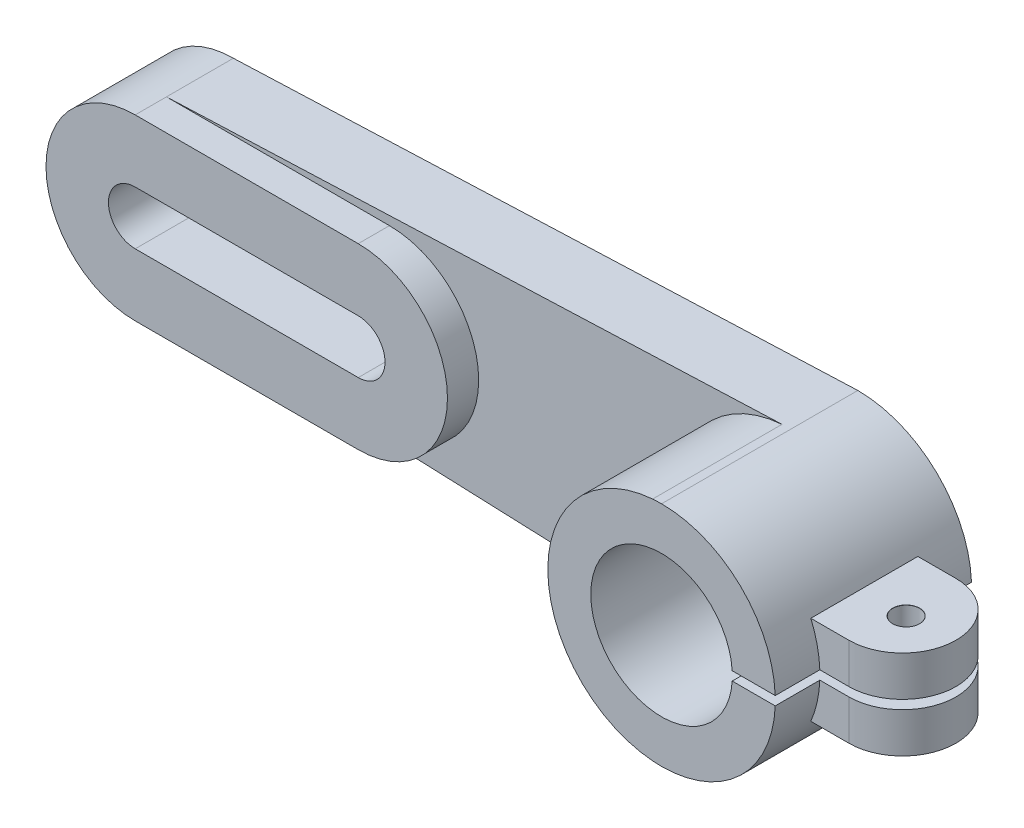
ISO-10303-21;
HEADER;
FILE_DESCRIPTION(('STEP AP214'),'2;1');
FILE_NAME('part.step','',(''),(''),'','','');
FILE_SCHEMA(('AUTOMOTIVE_DESIGN { 1 0 10303 214 1 1 1 1 }'));
ENDSEC;
DATA;
#1=APPLICATION_CONTEXT('core data for automotive mechanical design processes');
#2=APPLICATION_PROTOCOL_DEFINITION('international standard','automotive_design',2000,#1);
#3=PRODUCT_CONTEXT('',#1,'mechanical');
#4=PRODUCT('Part','Part','',(#3));
#5=PRODUCT_RELATED_PRODUCT_CATEGORY('part','',(#4));
#6=PRODUCT_DEFINITION_FORMATION('','',#4);
#7=PRODUCT_DEFINITION_CONTEXT('part definition',#1,'design');
#8=PRODUCT_DEFINITION('design','',#6,#7);
#9=PRODUCT_DEFINITION_SHAPE('','',#8);
#10=(LENGTH_UNIT() NAMED_UNIT(*) SI_UNIT(.MILLI.,.METRE.));
#11=(NAMED_UNIT(*) PLANE_ANGLE_UNIT() SI_UNIT($,.RADIAN.));
#12=(NAMED_UNIT(*) SI_UNIT($,.STERADIAN.) SOLID_ANGLE_UNIT());
#13=UNCERTAINTY_MEASURE_WITH_UNIT(LENGTH_MEASURE(1.E-05),#10,'distance_accuracy_value','');
#14=(GEOMETRIC_REPRESENTATION_CONTEXT(3) GLOBAL_UNCERTAINTY_ASSIGNED_CONTEXT((#13)) GLOBAL_UNIT_ASSIGNED_CONTEXT((#10,
#11,#12)) REPRESENTATION_CONTEXT('',''));
#15=CARTESIAN_POINT('',(0.,0.,0.));
#16=DIRECTION('',(0.,0.,1.));
#17=DIRECTION('',(1.,0.,0.));
#18=AXIS2_PLACEMENT_3D('',#15,#16,#17);
#19=CARTESIAN_POINT('',(32.,-9.99999999999999,22.));
#20=DIRECTION('',(0.,-1.,0.));
#21=DIRECTION('',(0.,0.,-1.));
#22=AXIS2_PLACEMENT_3D('',#19,#20,#21);
#23=CYLINDRICAL_SURFACE('',#22,12.);
#24=DIRECTION('',(0.,-1.,0.));
#25=VECTOR('',#24,1.);
#26=CARTESIAN_POINT('',(32.,0.,34.));
#27=LINE('',#26,#25);
#28=CARTESIAN_POINT('',(32.,-9.99999999999999,34.));
#29=VERTEX_POINT('',#28);
#30=CARTESIAN_POINT('',(32.,-0.999999999999999,34.));
#31=VERTEX_POINT('',#30);
#32=EDGE_CURVE('E389',#29,#31,#27,.F.);
#33=ORIENTED_EDGE('',*,*,#32,.F.);
#34=CARTESIAN_POINT('',(32.,-9.99999999999999,22.));
#35=DIRECTION('',(0.,-1.,0.));
#36=DIRECTION('',(1.,0.,0.));
#37=AXIS2_PLACEMENT_3D('',#34,#35,#36);
#38=CIRCLE('',#37,12.);
#39=CARTESIAN_POINT('',(32.,-9.99999999999999,10.));
#40=VERTEX_POINT('',#39);
#41=EDGE_CURVE('E46',#40,#29,#38,.T.);
#42=ORIENTED_EDGE('',*,*,#41,.F.);
#43=DIRECTION('',(0.,1.,0.));
#44=VECTOR('',#43,1.);
#45=CARTESIAN_POINT('',(32.,-9.99999999999999,10.));
#46=LINE('',#45,#44);
#47=CARTESIAN_POINT('',(32.,-0.999999999999999,10.));
#48=VERTEX_POINT('',#47);
#49=EDGE_CURVE('E391',#48,#40,#46,.F.);
#50=ORIENTED_EDGE('',*,*,#49,.F.);
#51=CARTESIAN_POINT('',(32.,-0.999999999999997,22.));
#52=DIRECTION('',(0.,1.,0.));
#53=DIRECTION('',(-1.,0.,0.));
#54=AXIS2_PLACEMENT_3D('',#51,#52,#53);
#55=CIRCLE('',#54,12.);
#56=EDGE_CURVE('E11',#31,#48,#55,.T.);
#57=ORIENTED_EDGE('',*,*,#56,.F.);
#58=EDGE_LOOP('',(#33,#42,#50,#57));
#59=FACE_BOUND('',#58,.T.);
#60=ADVANCED_FACE('F37',(#59),#23,.T.);
#61=CARTESIAN_POINT('',(32.,1.00000000000001,22.));
#62=DIRECTION('',(0.,1.,0.));
#63=DIRECTION('',(0.,0.,1.));
#64=AXIS2_PLACEMENT_3D('',#61,#62,#63);
#65=CYLINDRICAL_SURFACE('',#64,12.);
#66=DIRECTION('',(0.,-1.,0.));
#67=VECTOR('',#66,1.);
#68=CARTESIAN_POINT('',(32.,1.00000000000001,34.));
#69=LINE('',#68,#67);
#70=CARTESIAN_POINT('',(32.,1.00000000000001,34.));
#71=VERTEX_POINT('',#70);
#72=CARTESIAN_POINT('',(32.,10.,34.));
#73=VERTEX_POINT('',#72);
#74=EDGE_CURVE('E379',#71,#73,#69,.F.);
#75=ORIENTED_EDGE('',*,*,#74,.F.);
#76=CARTESIAN_POINT('',(32.,1.00000000000001,22.));
#77=DIRECTION('',(0.,1.,0.));
#78=DIRECTION('',(0.,0.,1.));
#79=AXIS2_PLACEMENT_3D('',#76,#77,#78);
#80=CIRCLE('',#79,12.);
#81=CARTESIAN_POINT('',(32.,1.00000000000001,10.));
#82=VERTEX_POINT('',#81);
#83=EDGE_CURVE('E385',#82,#71,#80,.F.);
#84=ORIENTED_EDGE('',*,*,#83,.F.);
#85=DIRECTION('',(0.,1.,0.));
#86=VECTOR('',#85,1.);
#87=CARTESIAN_POINT('',(32.,0.,10.));
#88=LINE('',#87,#86);
#89=CARTESIAN_POINT('',(32.,10.,10.));
#90=VERTEX_POINT('',#89);
#91=EDGE_CURVE('E382',#90,#82,#88,.F.);
#92=ORIENTED_EDGE('',*,*,#91,.F.);
#93=CARTESIAN_POINT('',(32.,10.,22.));
#94=DIRECTION('',(0.,-1.,0.));
#95=DIRECTION('',(1.,0.,0.));
#96=AXIS2_PLACEMENT_3D('',#93,#94,#95);
#97=CIRCLE('',#96,12.);
#98=EDGE_CURVE('E387',#73,#90,#97,.F.);
#99=ORIENTED_EDGE('',*,*,#98,.F.);
#100=EDGE_LOOP('',(#75,#84,#92,#99));
#101=FACE_BOUND('',#100,.T.);
#102=ADVANCED_FACE('F438',(#101),#65,.T.);
#103=CARTESIAN_POINT('',(0.,0.,44.));
#104=DIRECTION('',(0.,0.,-1.));
#105=DIRECTION('',(-1.,0.,0.));
#106=AXIS2_PLACEMENT_3D('',#103,#104,#105);
#107=CYLINDRICAL_SURFACE('',#106,15.8675);
#108=CARTESIAN_POINT('',(0.,0.,0.));
#109=DIRECTION('',(0.,0.,1.));
#110=DIRECTION('',(1.,0.,0.));
#111=AXIS2_PLACEMENT_3D('',#108,#109,#110);
#112=CIRCLE('',#111,15.8675);
#113=CARTESIAN_POINT('',(15.8359576991731,1.00000000000001,0.));
#114=VERTEX_POINT('',#113);
#115=CARTESIAN_POINT('',(15.8359576991731,-1.,0.));
#116=VERTEX_POINT('',#115);
#117=EDGE_CURVE('E324',#114,#116,#112,.T.);
#118=ORIENTED_EDGE('',*,*,#117,.F.);
#119=DIRECTION('',(0.,0.,-1.));
#120=VECTOR('',#119,1.);
#121=CARTESIAN_POINT('',(15.8359576991731,1.00000000000001,44.));
#122=LINE('',#121,#120);
#123=CARTESIAN_POINT('',(15.8359576991731,1.00000000000001,44.));
#124=VERTEX_POINT('',#123);
#125=EDGE_CURVE('E377',#124,#114,#122,.T.);
#126=ORIENTED_EDGE('',*,*,#125,.F.);
#127=CARTESIAN_POINT('',(0.,0.,44.));
#128=DIRECTION('',(0.,0.,1.));
#129=DIRECTION('',(1.,0.,0.));
#130=AXIS2_PLACEMENT_3D('',#127,#128,#129);
#131=CIRCLE('',#130,15.8675);
#132=CARTESIAN_POINT('',(15.8359576991731,-1.,44.));
#133=VERTEX_POINT('',#132);
#134=EDGE_CURVE('E325',#124,#133,#131,.T.);
#135=ORIENTED_EDGE('',*,*,#134,.T.);
#136=DIRECTION('',(0.,0.,-1.));
#137=VECTOR('',#136,1.);
#138=CARTESIAN_POINT('',(15.8359576991731,-1.,44.));
#139=LINE('',#138,#137);
#140=EDGE_CURVE('E343',#133,#116,#139,.T.);
#141=ORIENTED_EDGE('',*,*,#140,.T.);
#142=EDGE_LOOP('',(#118,#126,#135,#141));
#143=FACE_BOUND('',#142,.T.);
#144=ADVANCED_FACE('F464',(#143),#107,.F.);
#145=CARTESIAN_POINT('',(0.,1.00000000000001,44.));
#146=DIRECTION('',(0.,1.,0.));
#147=DIRECTION('',(0.,0.,1.));
#148=AXIS2_PLACEMENT_3D('',#145,#146,#147);
#149=PLANE('',#148);
#150=CARTESIAN_POINT('',(33.693220203986,1.00000000000001,22.8639084435806));
#151=DIRECTION('',(0.,1.,0.));
#152=DIRECTION('',(0.,0.,1.));
#153=AXIS2_PLACEMENT_3D('',#150,#151,#152);
#154=CIRCLE('',#153,2.99999999999998);
#155=CARTESIAN_POINT('',(33.693220203986,1.00000000000001,25.8639084435806));
#156=VERTEX_POINT('',#155);
#157=EDGE_CURVE('E402',#156,#156,#154,.T.);
#158=ORIENTED_EDGE('',*,*,#157,.T.);
#159=EDGE_LOOP('',(#158));
#160=FACE_BOUND('',#159,.T.);
#161=DIRECTION('',(1.,0.,0.));
#162=VECTOR('',#161,1.);
#163=CARTESIAN_POINT('',(0.,1.00000000000001,10.));
#164=LINE('',#163,#162);
#165=CARTESIAN_POINT('',(25.4803846124818,1.00000000000001,10.));
#166=VERTEX_POINT('',#165);
#167=EDGE_CURVE('E228',#166,#82,#164,.T.);
#168=ORIENTED_EDGE('',*,*,#167,.T.);
#169=ORIENTED_EDGE('',*,*,#83,.T.);
#170=DIRECTION('',(1.,0.,0.));
#171=VECTOR('',#170,1.);
#172=CARTESIAN_POINT('',(0.,1.00000000000001,34.));
#173=LINE('',#172,#171);
#174=CARTESIAN_POINT('',(25.4803846124818,1.00000000000001,34.));
#175=VERTEX_POINT('',#174);
#176=EDGE_CURVE('E237',#175,#71,#173,.T.);
#177=ORIENTED_EDGE('',*,*,#176,.F.);
#178=DIRECTION('',(0.,0.,-1.));
#179=VECTOR('',#178,1.);
#180=CARTESIAN_POINT('',(25.4803846124818,1.00000000000001,44.));
#181=LINE('',#180,#179);
#182=CARTESIAN_POINT('',(25.4803846124818,1.00000000000001,44.));
#183=VERTEX_POINT('',#182);
#184=EDGE_CURVE('E375',#183,#175,#181,.T.);
#185=ORIENTED_EDGE('',*,*,#184,.F.);
#186=DIRECTION('',(1.,0.,0.));
#187=VECTOR('',#186,1.);
#188=CARTESIAN_POINT('',(0.,1.00000000000001,44.));
#189=LINE('',#188,#187);
#190=EDGE_CURVE('E328',#124,#183,#189,.T.);
#191=ORIENTED_EDGE('',*,*,#190,.F.);
#192=ORIENTED_EDGE('',*,*,#125,.T.);
#193=DIRECTION('',(1.,0.,0.));
#194=VECTOR('',#193,1.);
#195=CARTESIAN_POINT('',(0.,1.00000000000001,0.));
#196=LINE('',#195,#194);
#197=CARTESIAN_POINT('',(25.4803846124818,1.00000000000001,0.));
#198=VERTEX_POINT('',#197);
#199=EDGE_CURVE('E346',#114,#198,#196,.T.);
#200=ORIENTED_EDGE('',*,*,#199,.T.);
#201=EDGE_CURVE('E374',#166,#198,#181,.T.);
#202=ORIENTED_EDGE('',*,*,#201,.F.);
#203=EDGE_LOOP('',(#168,#169,#177,#185,#191,#192,#200,#202));
#204=FACE_BOUND('',#203,.T.);
#205=ADVANCED_FACE('F434',(#160,#204),#149,.F.);
#206=CARTESIAN_POINT('',(0.,0.,44.));
#207=DIRECTION('',(0.,0.,-1.));
#208=DIRECTION('',(-1.,0.,0.));
#209=AXIS2_PLACEMENT_3D('',#206,#207,#208);
#210=CYLINDRICAL_SURFACE('',#209,25.5);
#211=ORIENTED_EDGE('',*,*,#184,.T.);
#212=CARTESIAN_POINT('',(0.,0.,34.));
#213=DIRECTION('',(0.,0.,1.));
#214=DIRECTION('',(1.,0.,0.));
#215=AXIS2_PLACEMENT_3D('',#212,#213,#214);
#216=CIRCLE('',#215,25.5);
#217=CARTESIAN_POINT('',(23.4574082114798,10.,34.));
#218=VERTEX_POINT('',#217);
#219=EDGE_CURVE('E234',#175,#218,#216,.T.);
#220=ORIENTED_EDGE('',*,*,#219,.T.);
#221=DIRECTION('',(0.,0.,-1.));
#222=VECTOR('',#221,1.);
#223=CARTESIAN_POINT('',(23.4574082114798,10.,34.));
#224=LINE('',#223,#222);
#225=CARTESIAN_POINT('',(23.4574082114798,10.,10.));
#226=VERTEX_POINT('',#225);
#227=EDGE_CURVE('E242',#218,#226,#224,.T.);
#228=ORIENTED_EDGE('',*,*,#227,.T.);
#229=CARTESIAN_POINT('',(0.,0.,10.));
#230=DIRECTION('',(0.,0.,1.));
#231=DIRECTION('',(1.,0.,0.));
#232=AXIS2_PLACEMENT_3D('',#229,#230,#231);
#233=CIRCLE('',#232,25.5);
#234=EDGE_CURVE('E225',#166,#226,#233,.T.);
#235=ORIENTED_EDGE('',*,*,#234,.F.);
#236=ORIENTED_EDGE('',*,*,#201,.T.);
#237=CARTESIAN_POINT('',(0.,0.,0.));
#238=DIRECTION('',(0.,0.,1.));
#239=DIRECTION('',(1.,0.,0.));
#240=AXIS2_PLACEMENT_3D('',#237,#238,#239);
#241=CIRCLE('',#240,25.5);
#242=CARTESIAN_POINT('',(0.,25.5,0.));
#243=VERTEX_POINT('',#242);
#244=EDGE_CURVE('E349',#198,#243,#241,.T.);
#245=ORIENTED_EDGE('',*,*,#244,.T.);
#246=DIRECTION('',(0.,0.,-1.));
#247=VECTOR('',#246,1.);
#248=CARTESIAN_POINT('',(0.,25.5,44.));
#249=LINE('',#248,#247);
#250=CARTESIAN_POINT('',(0.,25.5,44.));
#251=VERTEX_POINT('',#250);
#252=EDGE_CURVE('E371',#251,#243,#249,.T.);
#253=ORIENTED_EDGE('',*,*,#252,.F.);
#254=CARTESIAN_POINT('',(0.,0.,44.));
#255=DIRECTION('',(0.,0.,1.));
#256=DIRECTION('',(1.,0.,0.));
#257=AXIS2_PLACEMENT_3D('',#254,#255,#256);
#258=CIRCLE('',#257,25.5);
#259=EDGE_CURVE('E331',#183,#251,#258,.T.);
#260=ORIENTED_EDGE('',*,*,#259,.F.);
#261=EDGE_LOOP('',(#211,#220,#228,#235,#236,#245,#253,#260));
#262=FACE_BOUND('',#261,.T.);
#263=ADVANCED_FACE('F427',(#262),#210,.T.);
#264=CARTESIAN_POINT('',(-1.0002419734848,25.4607047796131,44.));
#265=DIRECTION('',(0.0392554331880379,-0.999229208422782,0.));
#266=DIRECTION('',(0.999229208422782,0.0392554331880379,0.));
#267=AXIS2_PLACEMENT_3D('',#264,#265,#266);
#268=PLANE('',#267);
#269=DIRECTION('',(-0.999229208422782,-0.0392554331880379,0.));
#270=VECTOR('',#269,1.);
#271=CARTESIAN_POINT('',(-1.0002419734848,25.4607047796131,0.));
#272=LINE('',#271,#270);
#273=CARTESIAN_POINT('',(-140.,20.,0.));
#274=VERTEX_POINT('',#273);
#275=EDGE_CURVE('E351',#243,#274,#272,.T.);
#276=ORIENTED_EDGE('',*,*,#275,.T.);
#277=DIRECTION('',(0.,0.,-1.));
#278=VECTOR('',#277,1.);
#279=CARTESIAN_POINT('',(-140.,20.,15.));
#280=LINE('',#279,#278);
#281=CARTESIAN_POINT('',(-140.,20.,15.));
#282=VERTEX_POINT('',#281);
#283=EDGE_CURVE('E319',#282,#274,#280,.T.);
#284=ORIENTED_EDGE('',*,*,#283,.F.);
#285=DIRECTION('',(-0.999229208422782,-0.0392554331880379,0.));
#286=VECTOR('',#285,1.);
#287=CARTESIAN_POINT('',(-1.0002419734848,25.4607047796131,15.));
#288=LINE('',#287,#286);
#289=CARTESIAN_POINT('',(-2.00048394696963,25.4214095592262,15.));
#290=VERTEX_POINT('',#289);
#291=EDGE_CURVE('E313',#290,#282,#288,.T.);
#292=ORIENTED_EDGE('',*,*,#291,.F.);
#293=DIRECTION('',(0.,0.,-1.));
#294=VECTOR('',#293,1.);
#295=CARTESIAN_POINT('',(-2.00048394696963,25.4214095592262,44.));
#296=LINE('',#295,#294);
#297=CARTESIAN_POINT('',(-2.00048394696963,25.4214095592262,44.));
#298=VERTEX_POINT('',#297);
#299=EDGE_CURVE('E369',#298,#290,#296,.T.);
#300=ORIENTED_EDGE('',*,*,#299,.F.);
#301=DIRECTION('',(-0.999229208422782,-0.0392554331880379,0.));
#302=VECTOR('',#301,1.);
#303=CARTESIAN_POINT('',(-1.0002419734848,25.4607047796131,44.));
#304=LINE('',#303,#302);
#305=EDGE_CURVE('E333',#251,#298,#304,.T.);
#306=ORIENTED_EDGE('',*,*,#305,.F.);
#307=ORIENTED_EDGE('',*,*,#252,.T.);
#308=EDGE_LOOP('',(#276,#284,#292,#300,#306,#307));
#309=FACE_BOUND('',#308,.T.);
#310=ADVANCED_FACE('F452',(#309),#268,.F.);
#311=ORIENTED_EDGE('',*,*,#299,.T.);
#312=CARTESIAN_POINT('',(0.,0.,15.));
#313=DIRECTION('',(0.,0.,1.));
#314=DIRECTION('',(1.,0.,0.));
#315=AXIS2_PLACEMENT_3D('',#312,#313,#314);
#316=CIRCLE('',#315,25.5);
#317=CARTESIAN_POINT('',(-2.00048394696963,-25.4214095592262,15.));
#318=VERTEX_POINT('',#317);
#319=EDGE_CURVE('E311',#290,#318,#316,.T.);
#320=ORIENTED_EDGE('',*,*,#319,.T.);
#321=DIRECTION('',(0.,0.,-1.));
#322=VECTOR('',#321,1.);
#323=CARTESIAN_POINT('',(-2.00048394696963,-25.4214095592262,44.));
#324=LINE('',#323,#322);
#325=CARTESIAN_POINT('',(-2.00048394696963,-25.4214095592262,44.));
#326=VERTEX_POINT('',#325);
#327=EDGE_CURVE('E366',#326,#318,#324,.T.);
#328=ORIENTED_EDGE('',*,*,#327,.F.);
#329=EDGE_CURVE('E335',#298,#326,#258,.T.);
#330=ORIENTED_EDGE('',*,*,#329,.F.);
#331=EDGE_LOOP('',(#311,#320,#328,#330));
#332=FACE_BOUND('',#331,.T.);
#333=ADVANCED_FACE('F494',(#332),#210,.T.);
#334=CARTESIAN_POINT('',(-1.0002419734848,-25.4607047796131,44.));
#335=DIRECTION('',(-0.0392554331880379,-0.999229208422782,0.));
#336=DIRECTION('',(0.999229208422782,-0.0392554331880379,0.));
#337=AXIS2_PLACEMENT_3D('',#334,#335,#336);
#338=PLANE('',#337);
#339=DIRECTION('',(-0.999229208422782,0.0392554331880379,0.));
#340=VECTOR('',#339,1.);
#341=CARTESIAN_POINT('',(-1.0002419734848,-25.4607047796131,0.));
#342=LINE('',#341,#340);
#343=CARTESIAN_POINT('',(0.,-25.5,0.));
#344=VERTEX_POINT('',#343);
#345=CARTESIAN_POINT('',(-140.,-20.,0.));
#346=VERTEX_POINT('',#345);
#347=EDGE_CURVE('E355',#344,#346,#342,.T.);
#348=ORIENTED_EDGE('',*,*,#347,.F.);
#349=DIRECTION('',(0.,0.,-1.));
#350=VECTOR('',#349,1.);
#351=CARTESIAN_POINT('',(0.,-25.5,44.));
#352=LINE('',#351,#350);
#353=CARTESIAN_POINT('',(0.,-25.5,44.));
#354=VERTEX_POINT('',#353);
#355=EDGE_CURVE('E364',#354,#344,#352,.T.);
#356=ORIENTED_EDGE('',*,*,#355,.F.);
#357=DIRECTION('',(-0.999229208422782,0.0392554331880379,0.));
#358=VECTOR('',#357,1.);
#359=CARTESIAN_POINT('',(-1.0002419734848,-25.4607047796131,44.));
#360=LINE('',#359,#358);
#361=EDGE_CURVE('E337',#354,#326,#360,.T.);
#362=ORIENTED_EDGE('',*,*,#361,.T.);
#363=ORIENTED_EDGE('',*,*,#327,.T.);
#364=DIRECTION('',(-0.999229208422782,0.0392554331880379,0.));
#365=VECTOR('',#364,1.);
#366=CARTESIAN_POINT('',(-1.0002419734848,-25.4607047796131,15.));
#367=LINE('',#366,#365);
#368=CARTESIAN_POINT('',(-140.,-20.,15.));
#369=VERTEX_POINT('',#368);
#370=EDGE_CURVE('E308',#318,#369,#367,.T.);
#371=ORIENTED_EDGE('',*,*,#370,.T.);
#372=DIRECTION('',(0.,0.,-1.));
#373=VECTOR('',#372,1.);
#374=CARTESIAN_POINT('',(-140.,-20.,15.));
#375=LINE('',#374,#373);
#376=EDGE_CURVE('E321',#369,#346,#375,.T.);
#377=ORIENTED_EDGE('',*,*,#376,.T.);
#378=EDGE_LOOP('',(#348,#356,#362,#363,#371,#377));
#379=FACE_BOUND('',#378,.T.);
#380=ADVANCED_FACE('F472',(#379),#338,.T.);
#381=DIRECTION('',(0.,0.,-1.));
#382=VECTOR('',#381,1.);
#383=CARTESIAN_POINT('',(23.4574082114798,-10.,34.));
#384=LINE('',#383,#382);
#385=CARTESIAN_POINT('',(23.4574082114798,-10.,34.));
#386=VERTEX_POINT('',#385);
#387=CARTESIAN_POINT('',(23.4574082114798,-10.,10.));
#388=VERTEX_POINT('',#387);
#389=EDGE_CURVE('E207',#386,#388,#384,.T.);
#390=ORIENTED_EDGE('',*,*,#389,.F.);
#391=CARTESIAN_POINT('',(0.,0.,34.));
#392=DIRECTION('',(0.,0.,1.));
#393=DIRECTION('',(1.,0.,0.));
#394=AXIS2_PLACEMENT_3D('',#391,#392,#393);
#395=CIRCLE('',#394,25.5);
#396=CARTESIAN_POINT('',(25.4803846124818,-1.,34.));
#397=VERTEX_POINT('',#396);
#398=EDGE_CURVE('E212',#386,#397,#395,.T.);
#399=ORIENTED_EDGE('',*,*,#398,.T.);
#400=DIRECTION('',(0.,0.,-1.));
#401=VECTOR('',#400,1.);
#402=CARTESIAN_POINT('',(25.4803846124818,-1.,44.));
#403=LINE('',#402,#401);
#404=CARTESIAN_POINT('',(25.4803846124818,-1.,44.));
#405=VERTEX_POINT('',#404);
#406=EDGE_CURVE('E362',#405,#397,#403,.T.);
#407=ORIENTED_EDGE('',*,*,#406,.F.);
#408=EDGE_CURVE('E334',#354,#405,#258,.T.);
#409=ORIENTED_EDGE('',*,*,#408,.F.);
#410=ORIENTED_EDGE('',*,*,#355,.T.);
#411=CARTESIAN_POINT('',(25.4803846124818,-1.,0.));
#412=VERTEX_POINT('',#411);
#413=EDGE_CURVE('E352',#344,#412,#241,.T.);
#414=ORIENTED_EDGE('',*,*,#413,.T.);
#415=CARTESIAN_POINT('',(25.4803846124818,-1.,10.));
#416=VERTEX_POINT('',#415);
#417=EDGE_CURVE('E361',#416,#412,#403,.T.);
#418=ORIENTED_EDGE('',*,*,#417,.F.);
#419=CARTESIAN_POINT('',(0.,0.,10.));
#420=DIRECTION('',(0.,0.,1.));
#421=DIRECTION('',(1.,0.,0.));
#422=AXIS2_PLACEMENT_3D('',#419,#420,#421);
#423=CIRCLE('',#422,25.5);
#424=EDGE_CURVE('E224',#388,#416,#423,.T.);
#425=ORIENTED_EDGE('',*,*,#424,.F.);
#426=EDGE_LOOP('',(#390,#399,#407,#409,#410,#414,#418,#425));
#427=FACE_BOUND('',#426,.T.);
#428=ADVANCED_FACE('F221',(#427),#210,.T.);
#429=CARTESIAN_POINT('',(0.,-1.00000000000001,44.));
#430=DIRECTION('',(0.,1.,0.));
#431=DIRECTION('',(-1.,0.,0.));
#432=AXIS2_PLACEMENT_3D('',#429,#430,#431);
#433=PLANE('',#432);
#434=CARTESIAN_POINT('',(33.693220203986,-0.999999999999997,22.8639084435806));
#435=DIRECTION('',(0.,1.,0.));
#436=DIRECTION('',(-1.,0.,0.));
#437=AXIS2_PLACEMENT_3D('',#434,#435,#436);
#438=CIRCLE('',#437,2.99999999999998);
#439=CARTESIAN_POINT('',(30.693220203986,-0.999999999999998,22.8639084435806));
#440=VERTEX_POINT('',#439);
#441=EDGE_CURVE('E397',#440,#440,#438,.T.);
#442=ORIENTED_EDGE('',*,*,#441,.F.);
#443=EDGE_LOOP('',(#442));
#444=FACE_BOUND('',#443,.T.);
#445=DIRECTION('',(1.,0.,0.));
#446=VECTOR('',#445,1.);
#447=CARTESIAN_POINT('',(0.,-1.00000000000001,34.));
#448=LINE('',#447,#446);
#449=EDGE_CURVE('E211',#397,#31,#448,.T.);
#450=ORIENTED_EDGE('',*,*,#449,.T.);
#451=ORIENTED_EDGE('',*,*,#56,.T.);
#452=DIRECTION('',(1.,0.,0.));
#453=VECTOR('',#452,1.);
#454=CARTESIAN_POINT('',(0.,-1.00000000000001,10.));
#455=LINE('',#454,#453);
#456=EDGE_CURVE('E219',#416,#48,#455,.T.);
#457=ORIENTED_EDGE('',*,*,#456,.F.);
#458=ORIENTED_EDGE('',*,*,#417,.T.);
#459=DIRECTION('',(1.,0.,0.));
#460=VECTOR('',#459,1.);
#461=CARTESIAN_POINT('',(0.,-1.00000000000001,0.));
#462=LINE('',#461,#460);
#463=EDGE_CURVE('E329',#116,#412,#462,.T.);
#464=ORIENTED_EDGE('',*,*,#463,.F.);
#465=ORIENTED_EDGE('',*,*,#140,.F.);
#466=DIRECTION('',(1.,0.,0.));
#467=VECTOR('',#466,1.);
#468=CARTESIAN_POINT('',(0.,-1.00000000000001,44.));
#469=LINE('',#468,#467);
#470=EDGE_CURVE('E340',#133,#405,#469,.T.);
#471=ORIENTED_EDGE('',*,*,#470,.T.);
#472=ORIENTED_EDGE('',*,*,#406,.T.);
#473=EDGE_LOOP('',(#450,#451,#457,#458,#464,#465,#471,#472));
#474=FACE_BOUND('',#473,.T.);
#475=ADVANCED_FACE('F467',(#444,#474),#433,.T.);
#476=CARTESIAN_POINT('',(0.,0.,44.));
#477=DIRECTION('',(0.,0.,1.));
#478=DIRECTION('',(1.,0.,0.));
#479=AXIS2_PLACEMENT_3D('',#476,#477,#478);
#480=PLANE('',#479);
#481=ORIENTED_EDGE('',*,*,#134,.F.);
#482=ORIENTED_EDGE('',*,*,#190,.T.);
#483=ORIENTED_EDGE('',*,*,#259,.T.);
#484=ORIENTED_EDGE('',*,*,#305,.T.);
#485=ORIENTED_EDGE('',*,*,#329,.T.);
#486=ORIENTED_EDGE('',*,*,#361,.F.);
#487=ORIENTED_EDGE('',*,*,#408,.T.);
#488=ORIENTED_EDGE('',*,*,#470,.F.);
#489=EDGE_LOOP('',(#481,#482,#483,#484,#485,#486,#487,#488));
#490=FACE_BOUND('',#489,.T.);
#491=ADVANCED_FACE('F459',(#490),#480,.T.);
#492=CARTESIAN_POINT('',(0.,0.,0.));
#493=DIRECTION('',(0.,0.,1.));
#494=DIRECTION('',(1.,0.,0.));
#495=AXIS2_PLACEMENT_3D('',#492,#493,#494);
#496=PLANE('',#495);
#497=ORIENTED_EDGE('',*,*,#117,.T.);
#498=ORIENTED_EDGE('',*,*,#463,.T.);
#499=ORIENTED_EDGE('',*,*,#413,.F.);
#500=ORIENTED_EDGE('',*,*,#347,.T.);
#501=CARTESIAN_POINT('',(-140.,0.,0.));
#502=DIRECTION('',(0.,0.,1.));
#503=DIRECTION('',(1.,0.,0.));
#504=AXIS2_PLACEMENT_3D('',#501,#502,#503);
#505=CIRCLE('',#504,20.);
#506=EDGE_CURVE('E254',#274,#346,#505,.T.);
#507=ORIENTED_EDGE('',*,*,#506,.F.);
#508=ORIENTED_EDGE('',*,*,#275,.F.);
#509=ORIENTED_EDGE('',*,*,#244,.F.);
#510=ORIENTED_EDGE('',*,*,#199,.F.);
#511=EDGE_LOOP('',(#497,#498,#499,#500,#507,#508,#509,#510));
#512=FACE_BOUND('',#511,.T.);
#513=CARTESIAN_POINT('',(-140.,0.,0.));
#514=DIRECTION('',(0.,0.,1.));
#515=DIRECTION('',(1.,0.,0.));
#516=AXIS2_PLACEMENT_3D('',#513,#514,#515);
#517=CIRCLE('',#516,6.);
#518=CARTESIAN_POINT('',(-140.,5.99999999999998,0.));
#519=VERTEX_POINT('',#518);
#520=CARTESIAN_POINT('',(-140.,-6.00000000000002,0.));
#521=VERTEX_POINT('',#520);
#522=EDGE_CURVE('E249',#519,#521,#517,.T.);
#523=ORIENTED_EDGE('',*,*,#522,.T.);
#524=DIRECTION('',(-1.,0.,0.));
#525=VECTOR('',#524,1.);
#526=CARTESIAN_POINT('',(0.,-6.,0.));
#527=LINE('',#526,#525);
#528=CARTESIAN_POINT('',(-90.,-6.00000000000001,0.));
#529=VERTEX_POINT('',#528);
#530=EDGE_CURVE('E281',#529,#521,#527,.T.);
#531=ORIENTED_EDGE('',*,*,#530,.F.);
#532=CARTESIAN_POINT('',(-90.,0.,0.));
#533=DIRECTION('',(0.,0.,1.));
#534=DIRECTION('',(1.,0.,0.));
#535=AXIS2_PLACEMENT_3D('',#532,#533,#534);
#536=CIRCLE('',#535,6.);
#537=CARTESIAN_POINT('',(-90.,5.99999999999999,0.));
#538=VERTEX_POINT('',#537);
#539=EDGE_CURVE('E278',#529,#538,#536,.T.);
#540=ORIENTED_EDGE('',*,*,#539,.T.);
#541=DIRECTION('',(-1.,0.,0.));
#542=VECTOR('',#541,1.);
#543=CARTESIAN_POINT('',(0.,6.,0.));
#544=LINE('',#543,#542);
#545=EDGE_CURVE('E275',#538,#519,#544,.T.);
#546=ORIENTED_EDGE('',*,*,#545,.T.);
#547=EDGE_LOOP('',(#523,#531,#540,#546));
#548=FACE_BOUND('',#547,.T.);
#549=ADVANCED_FACE('F447',(#512,#548),#496,.F.);
#550=CARTESIAN_POINT('',(0.,0.,15.));
#551=DIRECTION('',(0.,0.,1.));
#552=DIRECTION('',(1.,0.,0.));
#553=AXIS2_PLACEMENT_3D('',#550,#551,#552);
#554=PLANE('',#553);
#555=CARTESIAN_POINT('',(-90.,0.,15.));
#556=DIRECTION('',(0.,0.,1.));
#557=DIRECTION('',(1.,0.,0.));
#558=AXIS2_PLACEMENT_3D('',#555,#556,#557);
#559=CIRCLE('',#558,20.);
#560=CARTESIAN_POINT('',(-90.,-20.,15.));
#561=VERTEX_POINT('',#560);
#562=CARTESIAN_POINT('',(-90.,20.,15.));
#563=VERTEX_POINT('',#562);
#564=EDGE_CURVE('E297',#561,#563,#559,.T.);
#565=ORIENTED_EDGE('',*,*,#564,.F.);
#566=DIRECTION('',(1.,0.,0.));
#567=VECTOR('',#566,1.);
#568=CARTESIAN_POINT('',(0.,-20.,15.));
#569=LINE('',#568,#567);
#570=EDGE_CURVE('E306',#369,#561,#569,.T.);
#571=ORIENTED_EDGE('',*,*,#570,.F.);
#572=ORIENTED_EDGE('',*,*,#370,.F.);
#573=ORIENTED_EDGE('',*,*,#319,.F.);
#574=ORIENTED_EDGE('',*,*,#291,.T.);
#575=DIRECTION('',(1.,0.,0.));
#576=VECTOR('',#575,1.);
#577=CARTESIAN_POINT('',(0.,20.,15.));
#578=LINE('',#577,#576);
#579=EDGE_CURVE('E316',#282,#563,#578,.T.);
#580=ORIENTED_EDGE('',*,*,#579,.T.);
#581=EDGE_LOOP('',(#565,#571,#572,#573,#574,#580));
#582=FACE_BOUND('',#581,.T.);
#583=ADVANCED_FACE('F485',(#582),#554,.T.);
#584=CARTESIAN_POINT('',(0.,-20.,22.));
#585=DIRECTION('',(0.,1.,0.));
#586=DIRECTION('',(-1.,0.,0.));
#587=AXIS2_PLACEMENT_3D('',#584,#585,#586);
#588=PLANE('',#587);
#589=ORIENTED_EDGE('',*,*,#570,.T.);
#590=DIRECTION('',(0.,0.,-1.));
#591=VECTOR('',#590,1.);
#592=CARTESIAN_POINT('',(-90.,-20.,22.));
#593=LINE('',#592,#591);
#594=CARTESIAN_POINT('',(-90.,-20.,22.));
#595=VERTEX_POINT('',#594);
#596=EDGE_CURVE('E294',#595,#561,#593,.T.);
#597=ORIENTED_EDGE('',*,*,#596,.F.);
#598=DIRECTION('',(1.,0.,0.));
#599=VECTOR('',#598,1.);
#600=CARTESIAN_POINT('',(0.,-20.,22.));
#601=LINE('',#600,#599);
#602=CARTESIAN_POINT('',(-140.,-20.,22.));
#603=VERTEX_POINT('',#602);
#604=EDGE_CURVE('E262',#603,#595,#601,.T.);
#605=ORIENTED_EDGE('',*,*,#604,.F.);
#606=DIRECTION('',(0.,0.,-1.));
#607=VECTOR('',#606,1.);
#608=CARTESIAN_POINT('',(-140.,-20.,22.));
#609=LINE('',#608,#607);
#610=EDGE_CURVE('E285',#603,#369,#609,.T.);
#611=ORIENTED_EDGE('',*,*,#610,.T.);
#612=EDGE_LOOP('',(#589,#597,#605,#611));
#613=FACE_BOUND('',#612,.T.);
#614=ADVANCED_FACE('F481',(#613),#588,.F.);
#615=CARTESIAN_POINT('',(-90.,0.,22.));
#616=DIRECTION('',(0.,0.,-1.));
#617=DIRECTION('',(-1.,0.,0.));
#618=AXIS2_PLACEMENT_3D('',#615,#616,#617);
#619=CYLINDRICAL_SURFACE('',#618,20.);
#620=ORIENTED_EDGE('',*,*,#564,.T.);
#621=DIRECTION('',(0.,0.,-1.));
#622=VECTOR('',#621,1.);
#623=CARTESIAN_POINT('',(-90.,20.,22.));
#624=LINE('',#623,#622);
#625=CARTESIAN_POINT('',(-90.,20.,22.));
#626=VERTEX_POINT('',#625);
#627=EDGE_CURVE('E292',#626,#563,#624,.T.);
#628=ORIENTED_EDGE('',*,*,#627,.F.);
#629=CARTESIAN_POINT('',(-90.,0.,22.));
#630=DIRECTION('',(0.,0.,1.));
#631=DIRECTION('',(1.,0.,0.));
#632=AXIS2_PLACEMENT_3D('',#629,#630,#631);
#633=CIRCLE('',#632,20.);
#634=EDGE_CURVE('E265',#595,#626,#633,.T.);
#635=ORIENTED_EDGE('',*,*,#634,.F.);
#636=ORIENTED_EDGE('',*,*,#596,.T.);
#637=EDGE_LOOP('',(#620,#628,#635,#636));
#638=FACE_BOUND('',#637,.T.);
#639=ADVANCED_FACE('F489',(#638),#619,.T.);
#640=CARTESIAN_POINT('',(0.,20.,22.));
#641=DIRECTION('',(0.,1.,0.));
#642=DIRECTION('',(-1.,0.,0.));
#643=AXIS2_PLACEMENT_3D('',#640,#641,#642);
#644=PLANE('',#643);
#645=ORIENTED_EDGE('',*,*,#627,.T.);
#646=ORIENTED_EDGE('',*,*,#579,.F.);
#647=DIRECTION('',(0.,0.,-1.));
#648=VECTOR('',#647,1.);
#649=CARTESIAN_POINT('',(-140.,20.,22.));
#650=LINE('',#649,#648);
#651=CARTESIAN_POINT('',(-140.,20.,22.));
#652=VERTEX_POINT('',#651);
#653=EDGE_CURVE('E288',#652,#282,#650,.T.);
#654=ORIENTED_EDGE('',*,*,#653,.F.);
#655=DIRECTION('',(1.,0.,0.));
#656=VECTOR('',#655,1.);
#657=CARTESIAN_POINT('',(0.,20.,22.));
#658=LINE('',#657,#656);
#659=EDGE_CURVE('E267',#652,#626,#658,.T.);
#660=ORIENTED_EDGE('',*,*,#659,.T.);
#661=EDGE_LOOP('',(#645,#646,#654,#660));
#662=FACE_BOUND('',#661,.T.);
#663=ADVANCED_FACE('F554',(#662),#644,.T.);
#664=CARTESIAN_POINT('',(-140.,0.,22.));
#665=DIRECTION('',(0.,0.,-1.));
#666=DIRECTION('',(-1.,0.,0.));
#667=AXIS2_PLACEMENT_3D('',#664,#665,#666);
#668=CYLINDRICAL_SURFACE('',#667,6.);
#669=ORIENTED_EDGE('',*,*,#522,.F.);
#670=DIRECTION('',(0.,0.,-1.));
#671=VECTOR('',#670,1.);
#672=CARTESIAN_POINT('',(-140.,5.99999999999998,22.));
#673=LINE('',#672,#671);
#674=CARTESIAN_POINT('',(-140.,5.99999999999998,22.));
#675=VERTEX_POINT('',#674);
#676=EDGE_CURVE('E289',#675,#519,#673,.T.);
#677=ORIENTED_EDGE('',*,*,#676,.F.);
#678=CARTESIAN_POINT('',(-140.,0.,22.));
#679=DIRECTION('',(0.,0.,1.));
#680=DIRECTION('',(1.,0.,0.));
#681=AXIS2_PLACEMENT_3D('',#678,#679,#680);
#682=CIRCLE('',#681,6.);
#683=CARTESIAN_POINT('',(-140.,-6.00000000000002,22.));
#684=VERTEX_POINT('',#683);
#685=EDGE_CURVE('E250',#675,#684,#682,.T.);
#686=ORIENTED_EDGE('',*,*,#685,.T.);
#687=DIRECTION('',(0.,0.,-1.));
#688=VECTOR('',#687,1.);
#689=CARTESIAN_POINT('',(-140.,-6.00000000000002,22.));
#690=LINE('',#689,#688);
#691=EDGE_CURVE('E272',#684,#521,#690,.T.);
#692=ORIENTED_EDGE('',*,*,#691,.T.);
#693=EDGE_LOOP('',(#669,#677,#686,#692));
#694=FACE_BOUND('',#693,.T.);
#695=ADVANCED_FACE('F557',(#694),#668,.F.);
#696=CARTESIAN_POINT('',(0.,6.,22.));
#697=DIRECTION('',(0.,-1.,0.));
#698=DIRECTION('',(1.,0.,0.));
#699=AXIS2_PLACEMENT_3D('',#696,#697,#698);
#700=PLANE('',#699);
#701=ORIENTED_EDGE('',*,*,#545,.F.);
#702=DIRECTION('',(0.,0.,-1.));
#703=VECTOR('',#702,1.);
#704=CARTESIAN_POINT('',(-90.,5.99999999999999,22.));
#705=LINE('',#704,#703);
#706=CARTESIAN_POINT('',(-90.,5.99999999999999,22.));
#707=VERTEX_POINT('',#706);
#708=EDGE_CURVE('E301',#707,#538,#705,.T.);
#709=ORIENTED_EDGE('',*,*,#708,.F.);
#710=DIRECTION('',(-1.,0.,0.));
#711=VECTOR('',#710,1.);
#712=CARTESIAN_POINT('',(0.,6.,22.));
#713=LINE('',#712,#711);
#714=EDGE_CURVE('E253',#707,#675,#713,.T.);
#715=ORIENTED_EDGE('',*,*,#714,.T.);
#716=ORIENTED_EDGE('',*,*,#676,.T.);
#717=EDGE_LOOP('',(#701,#709,#715,#716));
#718=FACE_BOUND('',#717,.T.);
#719=ADVANCED_FACE('F568',(#718),#700,.T.);
#720=CARTESIAN_POINT('',(-90.,0.,22.));
#721=DIRECTION('',(0.,0.,-1.));
#722=DIRECTION('',(-1.,0.,0.));
#723=AXIS2_PLACEMENT_3D('',#720,#721,#722);
#724=CYLINDRICAL_SURFACE('',#723,6.);
#725=ORIENTED_EDGE('',*,*,#539,.F.);
#726=DIRECTION('',(0.,0.,-1.));
#727=VECTOR('',#726,1.);
#728=CARTESIAN_POINT('',(-90.,-6.00000000000001,22.));
#729=LINE('',#728,#727);
#730=CARTESIAN_POINT('',(-90.,-6.00000000000001,22.));
#731=VERTEX_POINT('',#730);
#732=EDGE_CURVE('E299',#731,#529,#729,.T.);
#733=ORIENTED_EDGE('',*,*,#732,.F.);
#734=CARTESIAN_POINT('',(-90.,0.,22.));
#735=DIRECTION('',(0.,0.,1.));
#736=DIRECTION('',(1.,0.,0.));
#737=AXIS2_PLACEMENT_3D('',#734,#735,#736);
#738=CIRCLE('',#737,6.);
#739=EDGE_CURVE('E257',#731,#707,#738,.T.);
#740=ORIENTED_EDGE('',*,*,#739,.T.);
#741=ORIENTED_EDGE('',*,*,#708,.T.);
#742=EDGE_LOOP('',(#725,#733,#740,#741));
#743=FACE_BOUND('',#742,.T.);
#744=ADVANCED_FACE('F564',(#743),#724,.F.);
#745=CARTESIAN_POINT('',(0.,-6.,22.));
#746=DIRECTION('',(0.,-1.,0.));
#747=DIRECTION('',(1.,0.,0.));
#748=AXIS2_PLACEMENT_3D('',#745,#746,#747);
#749=PLANE('',#748);
#750=ORIENTED_EDGE('',*,*,#530,.T.);
#751=ORIENTED_EDGE('',*,*,#691,.F.);
#752=DIRECTION('',(-1.,0.,0.));
#753=VECTOR('',#752,1.);
#754=CARTESIAN_POINT('',(0.,-6.,22.));
#755=LINE('',#754,#753);
#756=EDGE_CURVE('E260',#731,#684,#755,.T.);
#757=ORIENTED_EDGE('',*,*,#756,.F.);
#758=ORIENTED_EDGE('',*,*,#732,.T.);
#759=EDGE_LOOP('',(#750,#751,#757,#758));
#760=FACE_BOUND('',#759,.T.);
#761=ADVANCED_FACE('F553',(#760),#749,.F.);
#762=CARTESIAN_POINT('',(-140.,0.,22.));
#763=DIRECTION('',(0.,0.,-1.));
#764=DIRECTION('',(-1.,0.,0.));
#765=AXIS2_PLACEMENT_3D('',#762,#763,#764);
#766=CYLINDRICAL_SURFACE('',#765,20.);
#767=ORIENTED_EDGE('',*,*,#506,.T.);
#768=ORIENTED_EDGE('',*,*,#376,.F.);
#769=ORIENTED_EDGE('',*,*,#610,.F.);
#770=CARTESIAN_POINT('',(-140.,0.,22.));
#771=DIRECTION('',(0.,0.,1.));
#772=DIRECTION('',(1.,0.,0.));
#773=AXIS2_PLACEMENT_3D('',#770,#771,#772);
#774=CIRCLE('',#773,20.);
#775=EDGE_CURVE('E270',#652,#603,#774,.T.);
#776=ORIENTED_EDGE('',*,*,#775,.F.);
#777=ORIENTED_EDGE('',*,*,#653,.T.);
#778=ORIENTED_EDGE('',*,*,#283,.T.);
#779=EDGE_LOOP('',(#767,#768,#769,#776,#777,#778));
#780=FACE_BOUND('',#779,.T.);
#781=ADVANCED_FACE('F476',(#780),#766,.T.);
#782=CARTESIAN_POINT('',(0.,0.,22.));
#783=DIRECTION('',(0.,0.,1.));
#784=DIRECTION('',(1.,0.,0.));
#785=AXIS2_PLACEMENT_3D('',#782,#783,#784);
#786=PLANE('',#785);
#787=ORIENTED_EDGE('',*,*,#685,.F.);
#788=ORIENTED_EDGE('',*,*,#714,.F.);
#789=ORIENTED_EDGE('',*,*,#739,.F.);
#790=ORIENTED_EDGE('',*,*,#756,.T.);
#791=EDGE_LOOP('',(#787,#788,#789,#790));
#792=FACE_BOUND('',#791,.T.);
#793=ORIENTED_EDGE('',*,*,#604,.T.);
#794=ORIENTED_EDGE('',*,*,#634,.T.);
#795=ORIENTED_EDGE('',*,*,#659,.F.);
#796=ORIENTED_EDGE('',*,*,#775,.T.);
#797=EDGE_LOOP('',(#793,#794,#795,#796));
#798=FACE_BOUND('',#797,.T.);
#799=ADVANCED_FACE('F418',(#792,#798),#786,.T.);
#800=CARTESIAN_POINT('',(0.,10.,34.));
#801=DIRECTION('',(0.,-1.,0.));
#802=DIRECTION('',(1.,0.,0.));
#803=AXIS2_PLACEMENT_3D('',#800,#801,#802);
#804=PLANE('',#803);
#805=CARTESIAN_POINT('',(33.693220203986,10.,22.8639084435806));
#806=DIRECTION('',(0.,1.,0.));
#807=DIRECTION('',(0.,0.,1.));
#808=AXIS2_PLACEMENT_3D('',#805,#806,#807);
#809=CIRCLE('',#808,3.025);
#810=CARTESIAN_POINT('',(33.693220203986,10.,25.8889084435806));
#811=VERTEX_POINT('',#810);
#812=EDGE_CURVE('E408',#811,#811,#809,.T.);
#813=ORIENTED_EDGE('',*,*,#812,.F.);
#814=EDGE_LOOP('',(#813));
#815=FACE_BOUND('',#814,.T.);
#816=DIRECTION('',(-1.,0.,0.));
#817=VECTOR('',#816,1.);
#818=CARTESIAN_POINT('',(0.,10.,34.));
#819=LINE('',#818,#817);
#820=EDGE_CURVE('E241',#73,#218,#819,.T.);
#821=ORIENTED_EDGE('',*,*,#820,.F.);
#822=ORIENTED_EDGE('',*,*,#98,.T.);
#823=DIRECTION('',(-1.,0.,0.));
#824=VECTOR('',#823,1.);
#825=CARTESIAN_POINT('',(0.,10.,10.));
#826=LINE('',#825,#824);
#827=EDGE_CURVE('E238',#90,#226,#826,.T.);
#828=ORIENTED_EDGE('',*,*,#827,.T.);
#829=ORIENTED_EDGE('',*,*,#227,.F.);
#830=EDGE_LOOP('',(#821,#822,#828,#829));
#831=FACE_BOUND('',#830,.T.);
#832=ADVANCED_FACE('F414',(#815,#831),#804,.F.);
#833=CARTESIAN_POINT('',(0.,0.,34.));
#834=DIRECTION('',(0.,0.,1.));
#835=DIRECTION('',(1.,0.,0.));
#836=AXIS2_PLACEMENT_3D('',#833,#834,#835);
#837=PLANE('',#836);
#838=ORIENTED_EDGE('',*,*,#176,.T.);
#839=ORIENTED_EDGE('',*,*,#74,.T.);
#840=ORIENTED_EDGE('',*,*,#820,.T.);
#841=ORIENTED_EDGE('',*,*,#219,.F.);
#842=EDGE_LOOP('',(#838,#839,#840,#841));
#843=FACE_BOUND('',#842,.T.);
#844=ADVANCED_FACE('F417',(#843),#837,.T.);
#845=CARTESIAN_POINT('',(0.,0.,10.));
#846=DIRECTION('',(0.,0.,1.));
#847=DIRECTION('',(1.,0.,0.));
#848=AXIS2_PLACEMENT_3D('',#845,#846,#847);
#849=PLANE('',#848);
#850=ORIENTED_EDGE('',*,*,#827,.F.);
#851=ORIENTED_EDGE('',*,*,#91,.T.);
#852=ORIENTED_EDGE('',*,*,#167,.F.);
#853=ORIENTED_EDGE('',*,*,#234,.T.);
#854=EDGE_LOOP('',(#850,#851,#852,#853));
#855=FACE_BOUND('',#854,.T.);
#856=ADVANCED_FACE('F441',(#855),#849,.F.);
#857=CARTESIAN_POINT('',(0.,-10.,34.));
#858=DIRECTION('',(0.,-1.,0.));
#859=DIRECTION('',(1.,0.,0.));
#860=AXIS2_PLACEMENT_3D('',#857,#858,#859);
#861=PLANE('',#860);
#862=CARTESIAN_POINT('',(33.693220203986,-9.99999999999999,22.8639084435806));
#863=DIRECTION('',(0.,-1.,0.));
#864=DIRECTION('',(1.,0.,0.));
#865=AXIS2_PLACEMENT_3D('',#862,#863,#864);
#866=CIRCLE('',#865,2.99999999999998);
#867=CARTESIAN_POINT('',(36.6932202039859,-9.99999999999999,22.8639084435806));
#868=VERTEX_POINT('',#867);
#869=EDGE_CURVE('E41',#868,#868,#866,.T.);
#870=ORIENTED_EDGE('',*,*,#869,.F.);
#871=EDGE_LOOP('',(#870));
#872=FACE_BOUND('',#871,.T.);
#873=DIRECTION('',(-1.,0.,0.));
#874=VECTOR('',#873,1.);
#875=CARTESIAN_POINT('',(0.,-10.,10.));
#876=LINE('',#875,#874);
#877=EDGE_CURVE('E396',#40,#388,#876,.T.);
#878=ORIENTED_EDGE('',*,*,#877,.F.);
#879=ORIENTED_EDGE('',*,*,#41,.T.);
#880=DIRECTION('',(-1.,0.,0.));
#881=VECTOR('',#880,1.);
#882=CARTESIAN_POINT('',(0.,-10.,34.));
#883=LINE('',#882,#881);
#884=EDGE_CURVE('E202',#29,#386,#883,.T.);
#885=ORIENTED_EDGE('',*,*,#884,.T.);
#886=ORIENTED_EDGE('',*,*,#389,.T.);
#887=EDGE_LOOP('',(#878,#879,#885,#886));
#888=FACE_BOUND('',#887,.T.);
#889=ADVANCED_FACE('F205',(#872,#888),#861,.T.);
#890=CARTESIAN_POINT('',(0.,0.,34.));
#891=DIRECTION('',(0.,0.,1.));
#892=DIRECTION('',(1.,0.,0.));
#893=AXIS2_PLACEMENT_3D('',#890,#891,#892);
#894=PLANE('',#893);
#895=ORIENTED_EDGE('',*,*,#884,.F.);
#896=ORIENTED_EDGE('',*,*,#32,.T.);
#897=ORIENTED_EDGE('',*,*,#449,.F.);
#898=ORIENTED_EDGE('',*,*,#398,.F.);
#899=EDGE_LOOP('',(#895,#896,#897,#898));
#900=FACE_BOUND('',#899,.T.);
#901=ADVANCED_FACE('F215',(#900),#894,.T.);
#902=CARTESIAN_POINT('',(0.,0.,10.));
#903=DIRECTION('',(0.,0.,1.));
#904=DIRECTION('',(1.,0.,0.));
#905=AXIS2_PLACEMENT_3D('',#902,#903,#904);
#906=PLANE('',#905);
#907=ORIENTED_EDGE('',*,*,#456,.T.);
#908=ORIENTED_EDGE('',*,*,#49,.T.);
#909=ORIENTED_EDGE('',*,*,#877,.T.);
#910=ORIENTED_EDGE('',*,*,#424,.T.);
#911=EDGE_LOOP('',(#907,#908,#909,#910));
#912=FACE_BOUND('',#911,.T.);
#913=ADVANCED_FACE('F395',(#912),#906,.F.);
#914=CARTESIAN_POINT('',(33.693220203986,10.,22.8639084435806));
#915=DIRECTION('',(0.,1.,0.));
#916=DIRECTION('',(0.,0.,1.));
#917=AXIS2_PLACEMENT_3D('',#914,#915,#916);
#918=CONICAL_SURFACE('',#917,3.025,0.785398163397171);
#919=CARTESIAN_POINT('',(33.693220203986,9.97499999999995,22.8639084435806));
#920=DIRECTION('',(0.,1.,0.));
#921=DIRECTION('',(0.,0.,1.));
#922=AXIS2_PLACEMENT_3D('',#919,#920,#921);
#923=CIRCLE('',#922,2.99999999999996);
#924=CARTESIAN_POINT('',(33.693220203986,9.97499999999995,25.8639084435806));
#925=VERTEX_POINT('',#924);
#926=EDGE_CURVE('E405',#925,#925,#923,.T.);
#927=ORIENTED_EDGE('',*,*,#926,.F.);
#928=EDGE_LOOP('',(#927));
#929=FACE_BOUND('',#928,.T.);
#930=ORIENTED_EDGE('',*,*,#812,.T.);
#931=EDGE_LOOP('',(#930));
#932=FACE_BOUND('',#931,.T.);
#933=ADVANCED_FACE('F412',(#929,#932),#918,.F.);
#934=CARTESIAN_POINT('',(33.693220203986,10.,22.8639084435806));
#935=DIRECTION('',(0.,1.,0.));
#936=DIRECTION('',(0.,0.,1.));
#937=AXIS2_PLACEMENT_3D('',#934,#935,#936);
#938=CYLINDRICAL_SURFACE('',#937,2.99999999999998);
#939=ORIENTED_EDGE('',*,*,#926,.T.);
#940=EDGE_LOOP('',(#939));
#941=FACE_BOUND('',#940,.T.);
#942=ORIENTED_EDGE('',*,*,#157,.F.);
#943=EDGE_LOOP('',(#942));
#944=FACE_BOUND('',#943,.T.);
#945=ADVANCED_FACE('F524',(#941,#944),#938,.F.);
#946=ORIENTED_EDGE('',*,*,#441,.T.);
#947=EDGE_LOOP('',(#946));
#948=FACE_BOUND('',#947,.T.);
#949=ORIENTED_EDGE('',*,*,#869,.T.);
#950=EDGE_LOOP('',(#949));
#951=FACE_BOUND('',#950,.T.);
#952=ADVANCED_FACE('F526',(#948,#951),#938,.F.);
#953=CLOSED_SHELL('',(#60,#102,#144,#205,#263,#310,#333,#380,#428,#475,#491,#549,#583,#614,#639,
#663,#695,#719,#744,#761,#781,#799,#832,#844,#856,#889,#901,#913,#933,#945,#952));
#954=MANIFOLD_SOLID_BREP('B2',#953);
#955=ADVANCED_BREP_SHAPE_REPRESENTATION('',(#18,#954),#14);
#956=SHAPE_DEFINITION_REPRESENTATION(#9,#955);
ENDSEC;
END-ISO-10303-21;
